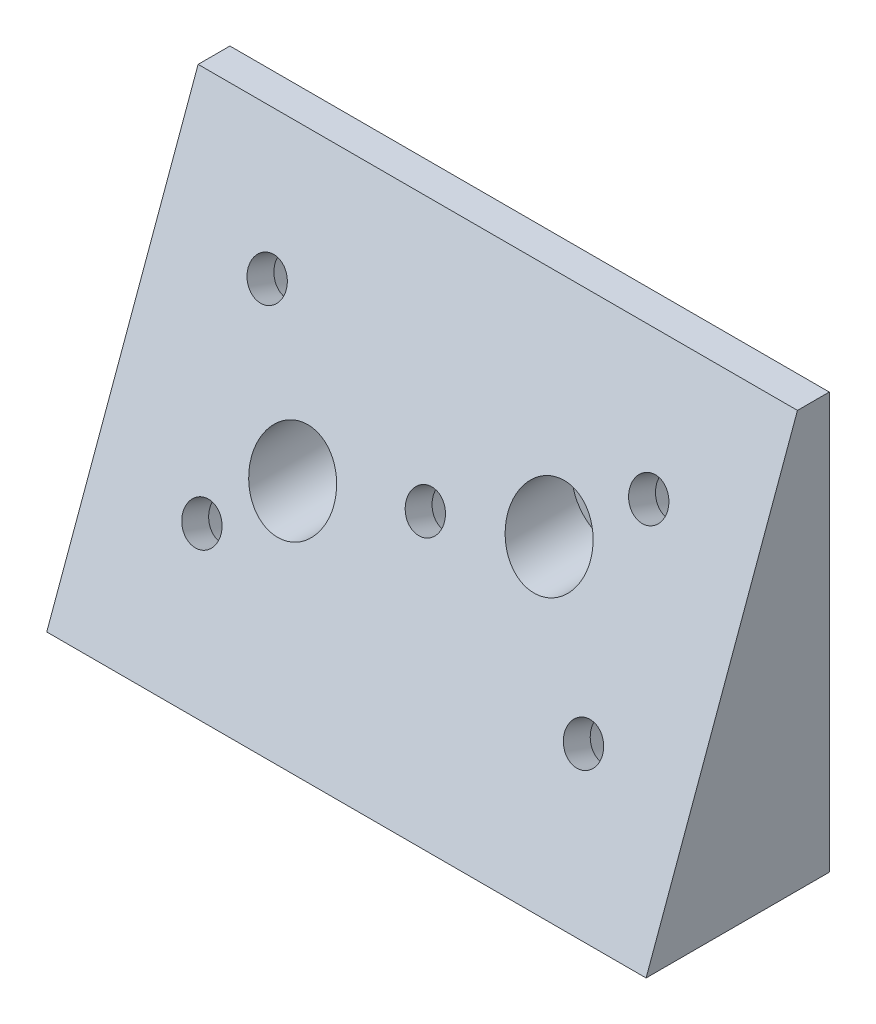
ISO-10303-21;
HEADER;
FILE_DESCRIPTION(('STEP AP214'),'2;1');
FILE_NAME('part.step','',(''),(''),'','','');
FILE_SCHEMA(('AUTOMOTIVE_DESIGN { 1 0 10303 214 1 1 1 1 }'));
ENDSEC;
DATA;
#1=APPLICATION_CONTEXT('core data for automotive mechanical design processes');
#2=APPLICATION_PROTOCOL_DEFINITION('international standard','automotive_design',2000,#1);
#3=PRODUCT_CONTEXT('',#1,'mechanical');
#4=PRODUCT('Part','Part','',(#3));
#5=PRODUCT_RELATED_PRODUCT_CATEGORY('part','',(#4));
#6=PRODUCT_DEFINITION_FORMATION('','',#4);
#7=PRODUCT_DEFINITION_CONTEXT('part definition',#1,'design');
#8=PRODUCT_DEFINITION('design','',#6,#7);
#9=PRODUCT_DEFINITION_SHAPE('','',#8);
#10=(LENGTH_UNIT() NAMED_UNIT(*) SI_UNIT(.MILLI.,.METRE.));
#11=(NAMED_UNIT(*) PLANE_ANGLE_UNIT() SI_UNIT($,.RADIAN.));
#12=(NAMED_UNIT(*) SI_UNIT($,.STERADIAN.) SOLID_ANGLE_UNIT());
#13=UNCERTAINTY_MEASURE_WITH_UNIT(LENGTH_MEASURE(1.E-05),#10,'distance_accuracy_value','');
#14=(GEOMETRIC_REPRESENTATION_CONTEXT(3) GLOBAL_UNCERTAINTY_ASSIGNED_CONTEXT((#13)) GLOBAL_UNIT_ASSIGNED_CONTEXT((#10,
#11,#12)) REPRESENTATION_CONTEXT('',''));
#15=CARTESIAN_POINT('',(0.,0.,0.));
#16=DIRECTION('',(0.,0.,1.));
#17=DIRECTION('',(1.,0.,0.));
#18=AXIS2_PLACEMENT_3D('',#15,#16,#17);
#19=CARTESIAN_POINT('',(0.,0.,5.));
#20=DIRECTION('',(1.,0.,0.));
#21=DIRECTION('',(0.,1.,0.));
#22=AXIS2_PLACEMENT_3D('',#19,#20,#21);
#23=PLANE('',#22);
#24=DIRECTION('',(0.,-1.,0.));
#25=VECTOR('',#24,1.);
#26=CARTESIAN_POINT('',(0.,0.,0.));
#27=LINE('',#26,#25);
#28=CARTESIAN_POINT('',(0.,0.,0.));
#29=VERTEX_POINT('',#28);
#30=CARTESIAN_POINT('',(0.,-65.39427142,0.));
#31=VERTEX_POINT('',#30);
#32=EDGE_CURVE('E90',#29,#31,#27,.T.);
#33=ORIENTED_EDGE('',*,*,#32,.T.);
#34=DIRECTION('',(0.,0.,-1.));
#35=VECTOR('',#34,1.);
#36=CARTESIAN_POINT('',(0.,-65.39427142,5.));
#37=LINE('',#36,#35);
#38=CARTESIAN_POINT('',(0.,-65.39427142,28.80156829));
#39=VERTEX_POINT('',#38);
#40=EDGE_CURVE('E11',#39,#31,#37,.T.);
#41=ORIENTED_EDGE('',*,*,#40,.F.);
#42=DIRECTION('',(0.,-0.939692620778542,0.342020143345907));
#43=VECTOR('',#42,1.);
#44=CARTESIAN_POINT('',(0.,-65.39427142,28.80156829));
#45=LINE('',#44,#43);
#46=CARTESIAN_POINT('',(0.,0.,5.));
#47=VERTEX_POINT('',#46);
#48=EDGE_CURVE('E172',#47,#39,#45,.T.);
#49=ORIENTED_EDGE('',*,*,#48,.F.);
#50=DIRECTION('',(0.,0.,-1.));
#51=VECTOR('',#50,1.);
#52=CARTESIAN_POINT('',(0.,0.,5.));
#53=LINE('',#52,#51);
#54=EDGE_CURVE('E85',#47,#29,#53,.T.);
#55=ORIENTED_EDGE('',*,*,#54,.T.);
#56=EDGE_LOOP('',(#33,#41,#49,#55));
#57=FACE_BOUND('',#56,.T.);
#58=ADVANCED_FACE('F37',(#57),#23,.F.);
#59=CARTESIAN_POINT('',(0.,-65.39427142,5.));
#60=DIRECTION('',(0.,1.,0.));
#61=DIRECTION('',(0.,0.,1.));
#62=AXIS2_PLACEMENT_3D('',#59,#60,#61);
#63=PLANE('',#62);
#64=DIRECTION('',(1.,0.,0.));
#65=VECTOR('',#64,1.);
#66=CARTESIAN_POINT('',(0.,-65.39427142,0.));
#67=LINE('',#66,#65);
#68=CARTESIAN_POINT('',(94.24092637,-65.39427142,0.));
#69=VERTEX_POINT('',#68);
#70=EDGE_CURVE('E76',#31,#69,#67,.T.);
#71=ORIENTED_EDGE('',*,*,#70,.T.);
#72=DIRECTION('',(0.,0.,-1.));
#73=VECTOR('',#72,1.);
#74=CARTESIAN_POINT('',(94.24092637,-65.39427142,5.));
#75=LINE('',#74,#73);
#76=CARTESIAN_POINT('',(94.24092637,-65.39427142,28.80156829));
#77=VERTEX_POINT('',#76);
#78=EDGE_CURVE('E46',#77,#69,#75,.T.);
#79=ORIENTED_EDGE('',*,*,#78,.F.);
#80=DIRECTION('',(1.,0.,0.));
#81=VECTOR('',#80,1.);
#82=CARTESIAN_POINT('',(0.,-65.39427142,28.80156829));
#83=LINE('',#82,#81);
#84=EDGE_CURVE('E175',#39,#77,#83,.T.);
#85=ORIENTED_EDGE('',*,*,#84,.F.);
#86=ORIENTED_EDGE('',*,*,#40,.T.);
#87=EDGE_LOOP('',(#71,#79,#85,#86));
#88=FACE_BOUND('',#87,.T.);
#89=ADVANCED_FACE('F180',(#88),#63,.F.);
#90=CARTESIAN_POINT('',(94.24092637,-65.39427142,5.));
#91=DIRECTION('',(-1.,0.,0.));
#92=DIRECTION('',(0.,0.,1.));
#93=AXIS2_PLACEMENT_3D('',#90,#91,#92);
#94=PLANE('',#93);
#95=DIRECTION('',(0.,1.,0.));
#96=VECTOR('',#95,1.);
#97=CARTESIAN_POINT('',(94.24092637,-65.39427142,0.));
#98=LINE('',#97,#96);
#99=CARTESIAN_POINT('',(94.24092637,0.,0.));
#100=VERTEX_POINT('',#99);
#101=EDGE_CURVE('E70',#69,#100,#98,.T.);
#102=ORIENTED_EDGE('',*,*,#101,.T.);
#103=DIRECTION('',(0.,0.,-1.));
#104=VECTOR('',#103,1.);
#105=CARTESIAN_POINT('',(94.24092637,0.,5.));
#106=LINE('',#105,#104);
#107=CARTESIAN_POINT('',(94.24092637,0.,5.));
#108=VERTEX_POINT('',#107);
#109=EDGE_CURVE('E54',#108,#100,#106,.T.);
#110=ORIENTED_EDGE('',*,*,#109,.F.);
#111=DIRECTION('',(0.,-0.939692620778542,0.342020143345907));
#112=VECTOR('',#111,1.);
#113=CARTESIAN_POINT('',(94.24092637,-65.39427142,28.80156829));
#114=LINE('',#113,#112);
#115=EDGE_CURVE('E169',#108,#77,#114,.T.);
#116=ORIENTED_EDGE('',*,*,#115,.T.);
#117=ORIENTED_EDGE('',*,*,#78,.T.);
#118=EDGE_LOOP('',(#102,#110,#116,#117));
#119=FACE_BOUND('',#118,.T.);
#120=ADVANCED_FACE('F71',(#119),#94,.F.);
#121=CARTESIAN_POINT('',(0.,0.,5.));
#122=DIRECTION('',(0.,-1.,0.));
#123=DIRECTION('',(0.,0.,-1.));
#124=AXIS2_PLACEMENT_3D('',#121,#122,#123);
#125=PLANE('',#124);
#126=DIRECTION('',(-1.,0.,0.));
#127=VECTOR('',#126,1.);
#128=CARTESIAN_POINT('',(0.,0.,0.));
#129=LINE('',#128,#127);
#130=EDGE_CURVE('E75',#100,#29,#129,.T.);
#131=ORIENTED_EDGE('',*,*,#130,.T.);
#132=ORIENTED_EDGE('',*,*,#54,.F.);
#133=DIRECTION('',(-1.,0.,0.));
#134=VECTOR('',#133,1.);
#135=CARTESIAN_POINT('',(0.,0.,5.));
#136=LINE('',#135,#134);
#137=EDGE_CURVE('E83',#108,#47,#136,.T.);
#138=ORIENTED_EDGE('',*,*,#137,.F.);
#139=ORIENTED_EDGE('',*,*,#109,.T.);
#140=EDGE_LOOP('',(#131,#132,#138,#139));
#141=FACE_BOUND('',#140,.T.);
#142=ADVANCED_FACE('F79',(#141),#125,.F.);
#143=CARTESIAN_POINT('',(0.,0.,0.));
#144=DIRECTION('',(0.,0.,1.));
#145=DIRECTION('',(1.,0.,0.));
#146=AXIS2_PLACEMENT_3D('',#143,#144,#145);
#147=PLANE('',#146);
#148=CARTESIAN_POINT('',(17.20092637,-21.5572592662761,0.));
#149=DIRECTION('',(0.,0.,1.));
#150=DIRECTION('',(0.,1.,0.));
#151=AXIS2_PLACEMENT_3D('',#148,#149,#150);
#152=ELLIPSE('',#151,5.05484441930021,4.75);
#153=CARTESIAN_POINT('',(17.20092637,-16.5024148469759,0.));
#154=VERTEX_POINT('',#153);
#155=EDGE_CURVE('E40',#154,#154,#152,.T.);
#156=ORIENTED_EDGE('',*,*,#155,.T.);
#157=EDGE_LOOP('',(#156));
#158=FACE_BOUND('',#157,.T.);
#159=CARTESIAN_POINT('',(77.20092637,-21.5572592662761,0.));
#160=DIRECTION('',(0.,0.,1.));
#161=DIRECTION('',(0.,1.,0.));
#162=AXIS2_PLACEMENT_3D('',#159,#160,#161);
#163=ELLIPSE('',#162,5.05484441930021,4.75);
#164=CARTESIAN_POINT('',(77.20092637,-16.5024148469759,0.));
#165=VERTEX_POINT('',#164);
#166=EDGE_CURVE('E135',#165,#165,#163,.T.);
#167=ORIENTED_EDGE('',*,*,#166,.T.);
#168=EDGE_LOOP('',(#167));
#169=FACE_BOUND('',#168,.T.);
#170=CARTESIAN_POINT('',(77.20092637,-53.4825924408038,0.));
#171=DIRECTION('',(0.,0.,1.));
#172=DIRECTION('',(0.,1.,0.));
#173=AXIS2_PLACEMENT_3D('',#170,#171,#172);
#174=ELLIPSE('',#173,5.05484441930021,4.75000000000001);
#175=CARTESIAN_POINT('',(77.20092637,-48.4277480215036,0.));
#176=VERTEX_POINT('',#175);
#177=EDGE_CURVE('E133',#176,#176,#174,.T.);
#178=ORIENTED_EDGE('',*,*,#177,.T.);
#179=EDGE_LOOP('',(#178));
#180=FACE_BOUND('',#179,.T.);
#181=CARTESIAN_POINT('',(47.20092637,-37.51992585354,0.));
#182=DIRECTION('',(0.,0.,1.));
#183=DIRECTION('',(0.,1.,0.));
#184=AXIS2_PLACEMENT_3D('',#181,#182,#183);
#185=ELLIPSE('',#184,5.0548444193002,4.75);
#186=CARTESIAN_POINT('',(47.20092637,-32.4650814342398,0.));
#187=VERTEX_POINT('',#186);
#188=EDGE_CURVE('E130',#187,#187,#185,.T.);
#189=ORIENTED_EDGE('',*,*,#188,.T.);
#190=EDGE_LOOP('',(#189));
#191=FACE_BOUND('',#190,.T.);
#192=CARTESIAN_POINT('',(17.20092637,-53.4825924408038,0.));
#193=DIRECTION('',(0.,0.,1.));
#194=DIRECTION('',(0.,1.,0.));
#195=AXIS2_PLACEMENT_3D('',#192,#193,#194);
#196=ELLIPSE('',#195,5.05484441930021,4.75);
#197=CARTESIAN_POINT('',(17.20092637,-48.4277480215036,0.));
#198=VERTEX_POINT('',#197);
#199=EDGE_CURVE('E127',#198,#198,#196,.T.);
#200=ORIENTED_EDGE('',*,*,#199,.T.);
#201=EDGE_LOOP('',(#200));
#202=FACE_BOUND('',#201,.T.);
#203=CARTESIAN_POINT('',(64.9901151539067,-26.9262359790259,0.));
#204=DIRECTION('',(0.,0.,-1.));
#205=DIRECTION('',(-1.,0.,0.));
#206=AXIS2_PLACEMENT_3D('',#203,#204,#205);
#207=CIRCLE('',#206,4.5);
#208=CARTESIAN_POINT('',(60.4901151539067,-26.9262359790259,0.));
#209=VERTEX_POINT('',#208);
#210=EDGE_CURVE('E166',#209,#209,#207,.T.);
#211=ORIENTED_EDGE('',*,*,#210,.F.);
#212=EDGE_LOOP('',(#211));
#213=FACE_BOUND('',#212,.T.);
#214=CARTESIAN_POINT('',(28.0218479846269,-36.143460200093,0.));
#215=DIRECTION('',(0.,0.,-1.));
#216=DIRECTION('',(-1.,0.,0.));
#217=AXIS2_PLACEMENT_3D('',#214,#215,#216);
#218=CIRCLE('',#217,4.5);
#219=CARTESIAN_POINT('',(23.5218479846269,-36.143460200093,0.));
#220=VERTEX_POINT('',#219);
#221=EDGE_CURVE('E110',#220,#220,#218,.T.);
#222=ORIENTED_EDGE('',*,*,#221,.F.);
#223=EDGE_LOOP('',(#222));
#224=FACE_BOUND('',#223,.T.);
#225=ORIENTED_EDGE('',*,*,#32,.F.);
#226=ORIENTED_EDGE('',*,*,#130,.F.);
#227=ORIENTED_EDGE('',*,*,#101,.F.);
#228=ORIENTED_EDGE('',*,*,#70,.F.);
#229=EDGE_LOOP('',(#225,#226,#227,#228));
#230=FACE_BOUND('',#229,.T.);
#231=ADVANCED_FACE('F88',(#158,#169,#180,#191,#202,#213,#224,#230),#147,.F.);
#232=CARTESIAN_POINT('',(0.,-65.39427142,28.80156829));
#233=DIRECTION('',(0.,0.342020143345907,0.939692620778542));
#234=DIRECTION('',(0.,-0.939692620778542,0.342020143345907));
#235=AXIS2_PLACEMENT_3D('',#232,#233,#234);
#236=PLANE('',#235);
#237=CARTESIAN_POINT('',(47.20092637,-31.5239592551219,16.4737828358538));
#238=DIRECTION('',(0.,0.342020143345907,0.939692620778542));
#239=DIRECTION('',(0.,-0.939692620778542,0.342020143345907));
#240=AXIS2_PLACEMENT_3D('',#237,#238,#239);
#241=CIRCLE('',#240,3.);
#242=CARTESIAN_POINT('',(47.20092637,-34.3430371174575,17.4998432658915));
#243=VERTEX_POINT('',#242);
#244=EDGE_CURVE('E153',#243,#243,#241,.T.);
#245=ORIENTED_EDGE('',*,*,#244,.F.);
#246=EDGE_LOOP('',(#245));
#247=FACE_BOUND('',#246,.T.);
#248=CARTESIAN_POINT('',(17.20092637,-45.6193485668,21.6040849860424));
#249=DIRECTION('',(0.,0.342020143345907,0.939692620778542));
#250=DIRECTION('',(0.,-0.939692620778542,0.342020143345907));
#251=AXIS2_PLACEMENT_3D('',#248,#249,#250);
#252=CIRCLE('',#251,3.);
#253=CARTESIAN_POINT('',(17.20092637,-48.4384264291357,22.6301454160801));
#254=VERTEX_POINT('',#253);
#255=EDGE_CURVE('E149',#254,#254,#252,.T.);
#256=ORIENTED_EDGE('',*,*,#255,.F.);
#257=EDGE_LOOP('',(#256));
#258=FACE_BOUND('',#257,.T.);
#259=CARTESIAN_POINT('',(17.20092637,-17.4285699434438,11.3434806856652));
#260=DIRECTION('',(0.,0.342020143345907,0.939692620778542));
#261=DIRECTION('',(0.,-0.939692620778542,0.342020143345907));
#262=AXIS2_PLACEMENT_3D('',#259,#260,#261);
#263=CIRCLE('',#262,3.);
#264=CARTESIAN_POINT('',(17.20092637,-20.2476478057794,12.3695411157029));
#265=VERTEX_POINT('',#264);
#266=EDGE_CURVE('E144',#265,#265,#263,.T.);
#267=ORIENTED_EDGE('',*,*,#266,.F.);
#268=EDGE_LOOP('',(#267));
#269=FACE_BOUND('',#268,.T.);
#270=CARTESIAN_POINT('',(77.20092637,-17.4285699434438,11.3434806856652));
#271=DIRECTION('',(0.,0.342020143345907,0.939692620778542));
#272=DIRECTION('',(0.,-0.939692620778542,0.342020143345907));
#273=AXIS2_PLACEMENT_3D('',#270,#271,#272);
#274=CIRCLE('',#273,3.00000000000001);
#275=CARTESIAN_POINT('',(77.20092637,-20.2476478057794,12.3695411157029));
#276=VERTEX_POINT('',#275);
#277=EDGE_CURVE('E140',#276,#276,#274,.T.);
#278=ORIENTED_EDGE('',*,*,#277,.F.);
#279=EDGE_LOOP('',(#278));
#280=FACE_BOUND('',#279,.T.);
#281=CARTESIAN_POINT('',(77.20092637,-45.6193485668,21.6040849860424));
#282=DIRECTION('',(0.,0.342020143345907,0.939692620778542));
#283=DIRECTION('',(0.,-0.939692620778542,0.342020143345907));
#284=AXIS2_PLACEMENT_3D('',#281,#282,#283);
#285=CIRCLE('',#284,3.00000000000001);
#286=CARTESIAN_POINT('',(77.20092637,-48.4384264291357,22.6301454160801));
#287=VERTEX_POINT('',#286);
#288=EDGE_CURVE('E156',#287,#287,#285,.T.);
#289=ORIENTED_EDGE('',*,*,#288,.F.);
#290=EDGE_LOOP('',(#289));
#291=FACE_BOUND('',#290,.T.);
#292=CARTESIAN_POINT('',(64.9901151539067,-26.9262359790259,14.8003484178498));
#293=DIRECTION('',(0.,0.342020143345907,0.939692620778542));
#294=DIRECTION('',(0.,0.939692620778542,-0.342020143345907));
#295=AXIS2_PLACEMENT_3D('',#292,#293,#294);
#296=ELLIPSE('',#295,6.91715552114765,6.5);
#297=CARTESIAN_POINT('',(64.9901151539067,-20.4262359790259,12.434541894961));
#298=VERTEX_POINT('',#297);
#299=EDGE_CURVE('E107',#298,#298,#296,.T.);
#300=ORIENTED_EDGE('',*,*,#299,.F.);
#301=EDGE_LOOP('',(#300));
#302=FACE_BOUND('',#301,.T.);
#303=CARTESIAN_POINT('',(28.0218479846269,-36.143460200093,18.1551436771006));
#304=DIRECTION('',(0.,0.342020143345907,0.939692620778542));
#305=DIRECTION('',(0.,0.939692620778542,-0.342020143345907));
#306=AXIS2_PLACEMENT_3D('',#303,#304,#305);
#307=ELLIPSE('',#306,6.91715552114765,6.5);
#308=CARTESIAN_POINT('',(28.0218479846269,-29.643460200093,15.7893371542117));
#309=VERTEX_POINT('',#308);
#310=EDGE_CURVE('E104',#309,#309,#307,.T.);
#311=ORIENTED_EDGE('',*,*,#310,.F.);
#312=EDGE_LOOP('',(#311));
#313=FACE_BOUND('',#312,.T.);
#314=ORIENTED_EDGE('',*,*,#115,.F.);
#315=ORIENTED_EDGE('',*,*,#137,.T.);
#316=ORIENTED_EDGE('',*,*,#48,.T.);
#317=ORIENTED_EDGE('',*,*,#84,.T.);
#318=EDGE_LOOP('',(#314,#315,#316,#317));
#319=FACE_BOUND('',#318,.T.);
#320=ADVANCED_FACE('F188',(#247,#258,#269,#280,#291,#302,#313,#319),#236,.T.);
#321=CARTESIAN_POINT('',(28.0218479846269,-36.143460200093,94.24092637));
#322=DIRECTION('',(0.,0.,-1.));
#323=DIRECTION('',(-1.,0.,0.));
#324=AXIS2_PLACEMENT_3D('',#321,#322,#323);
#325=CYLINDRICAL_SURFACE('',#324,4.5);
#326=CARTESIAN_POINT('',(28.0218479846269,-36.143460200093,4.69));
#327=DIRECTION('',(0.,0.,-1.));
#328=DIRECTION('',(-1.,0.,0.));
#329=AXIS2_PLACEMENT_3D('',#326,#327,#328);
#330=CIRCLE('',#329,4.5);
#331=CARTESIAN_POINT('',(23.5218479846269,-36.143460200093,4.69));
#332=VERTEX_POINT('',#331);
#333=EDGE_CURVE('E100',#332,#332,#330,.F.);
#334=ORIENTED_EDGE('',*,*,#333,.T.);
#335=EDGE_LOOP('',(#334));
#336=FACE_BOUND('',#335,.T.);
#337=ORIENTED_EDGE('',*,*,#221,.T.);
#338=EDGE_LOOP('',(#337));
#339=FACE_BOUND('',#338,.T.);
#340=ADVANCED_FACE('F190',(#336,#339),#325,.F.);
#341=CARTESIAN_POINT('',(64.9901151539067,-26.9262359790259,94.24092637));
#342=DIRECTION('',(0.,0.,-1.));
#343=DIRECTION('',(-1.,0.,0.));
#344=AXIS2_PLACEMENT_3D('',#341,#342,#343);
#345=CYLINDRICAL_SURFACE('',#344,4.5);
#346=CARTESIAN_POINT('',(64.9901151539067,-26.9262359790259,4.69));
#347=DIRECTION('',(0.,0.,-1.));
#348=DIRECTION('',(-1.,0.,0.));
#349=AXIS2_PLACEMENT_3D('',#346,#347,#348);
#350=CIRCLE('',#349,4.5);
#351=CARTESIAN_POINT('',(60.4901151539067,-26.9262359790259,4.69));
#352=VERTEX_POINT('',#351);
#353=EDGE_CURVE('E97',#352,#352,#350,.F.);
#354=ORIENTED_EDGE('',*,*,#353,.T.);
#355=EDGE_LOOP('',(#354));
#356=FACE_BOUND('',#355,.T.);
#357=ORIENTED_EDGE('',*,*,#210,.T.);
#358=EDGE_LOOP('',(#357));
#359=FACE_BOUND('',#358,.T.);
#360=ADVANCED_FACE('F197',(#356,#359),#345,.F.);
#361=CARTESIAN_POINT('',(64.9901151539067,-26.9262359790259,4.69));
#362=DIRECTION('',(0.,0.,-1.));
#363=DIRECTION('',(-1.,0.,0.));
#364=AXIS2_PLACEMENT_3D('',#361,#362,#363);
#365=PLANE('',#364);
#366=CARTESIAN_POINT('',(64.9901151539067,-26.9262359790259,4.69));
#367=DIRECTION('',(0.,0.,-1.));
#368=DIRECTION('',(-1.,0.,0.));
#369=AXIS2_PLACEMENT_3D('',#366,#367,#368);
#370=CIRCLE('',#369,6.5);
#371=CARTESIAN_POINT('',(58.4901151539067,-26.9262359790259,4.69));
#372=VERTEX_POINT('',#371);
#373=EDGE_CURVE('E101',#372,#372,#370,.T.);
#374=ORIENTED_EDGE('',*,*,#373,.F.);
#375=EDGE_LOOP('',(#374));
#376=FACE_BOUND('',#375,.T.);
#377=ORIENTED_EDGE('',*,*,#353,.F.);
#378=EDGE_LOOP('',(#377));
#379=FACE_BOUND('',#378,.T.);
#380=ADVANCED_FACE('F386',(#376,#379),#365,.F.);
#381=CARTESIAN_POINT('',(64.9901151539067,-26.9262359790259,98.93092637));
#382=DIRECTION('',(0.,0.,-1.));
#383=DIRECTION('',(-1.,0.,0.));
#384=AXIS2_PLACEMENT_3D('',#381,#382,#383);
#385=CYLINDRICAL_SURFACE('',#384,6.5);
#386=ORIENTED_EDGE('',*,*,#299,.T.);
#387=EDGE_LOOP('',(#386));
#388=FACE_BOUND('',#387,.T.);
#389=ORIENTED_EDGE('',*,*,#373,.T.);
#390=EDGE_LOOP('',(#389));
#391=FACE_BOUND('',#390,.T.);
#392=ADVANCED_FACE('F389',(#388,#391),#385,.F.);
#393=CARTESIAN_POINT('',(28.0218479846269,-36.143460200093,4.69));
#394=DIRECTION('',(0.,0.,-1.));
#395=DIRECTION('',(-1.,0.,0.));
#396=AXIS2_PLACEMENT_3D('',#393,#394,#395);
#397=PLANE('',#396);
#398=CARTESIAN_POINT('',(28.0218479846269,-36.143460200093,4.69));
#399=DIRECTION('',(0.,0.,-1.));
#400=DIRECTION('',(-1.,0.,0.));
#401=AXIS2_PLACEMENT_3D('',#398,#399,#400);
#402=CIRCLE('',#401,6.5);
#403=CARTESIAN_POINT('',(21.5218479846269,-36.143460200093,4.69));
#404=VERTEX_POINT('',#403);
#405=EDGE_CURVE('E161',#404,#404,#402,.T.);
#406=ORIENTED_EDGE('',*,*,#405,.F.);
#407=EDGE_LOOP('',(#406));
#408=FACE_BOUND('',#407,.T.);
#409=ORIENTED_EDGE('',*,*,#333,.F.);
#410=EDGE_LOOP('',(#409));
#411=FACE_BOUND('',#410,.T.);
#412=ADVANCED_FACE('F393',(#408,#411),#397,.F.);
#413=CARTESIAN_POINT('',(28.0218479846269,-36.143460200093,98.93092637));
#414=DIRECTION('',(0.,0.,-1.));
#415=DIRECTION('',(-1.,0.,0.));
#416=AXIS2_PLACEMENT_3D('',#413,#414,#415);
#417=CYLINDRICAL_SURFACE('',#416,6.5);
#418=ORIENTED_EDGE('',*,*,#310,.T.);
#419=EDGE_LOOP('',(#418));
#420=FACE_BOUND('',#419,.T.);
#421=ORIENTED_EDGE('',*,*,#405,.T.);
#422=EDGE_LOOP('',(#421));
#423=FACE_BOUND('',#422,.T.);
#424=ADVANCED_FACE('F237',(#420,#423),#417,.F.);
#425=CARTESIAN_POINT('',(77.20092637,-77.8516437129185,-66.9534180991805));
#426=DIRECTION('',(0.,0.342020143345907,0.939692620778542));
#427=DIRECTION('',(0.,-0.939692620778542,0.342020143345907));
#428=AXIS2_PLACEMENT_3D('',#425,#426,#427);
#429=CYLINDRICAL_SURFACE('',#428,3.00000000000001);
#430=CARTESIAN_POINT('',(77.20092637,-47.1584392118566,17.375468192539));
#431=DIRECTION('',(0.,0.342020143345907,0.939692620778542));
#432=DIRECTION('',(0.,-0.939692620778542,0.342020143345907));
#433=AXIS2_PLACEMENT_3D('',#430,#431,#432);
#434=CIRCLE('',#433,3.00000000000001);
#435=CARTESIAN_POINT('',(77.20092637,-49.9775170741923,18.4015286225767));
#436=VERTEX_POINT('',#435);
#437=EDGE_CURVE('E124',#436,#436,#434,.F.);
#438=ORIENTED_EDGE('',*,*,#437,.T.);
#439=EDGE_LOOP('',(#438));
#440=FACE_BOUND('',#439,.T.);
#441=ORIENTED_EDGE('',*,*,#288,.T.);
#442=EDGE_LOOP('',(#441));
#443=FACE_BOUND('',#442,.T.);
#444=ADVANCED_FACE('F231',(#440,#443),#429,.F.);
#445=CARTESIAN_POINT('',(77.20092637,-49.6608650895622,-77.2140223995577));
#446=DIRECTION('',(0.,0.342020143345907,0.939692620778542));
#447=DIRECTION('',(0.,-0.939692620778542,0.342020143345907));
#448=AXIS2_PLACEMENT_3D('',#445,#446,#447);
#449=CYLINDRICAL_SURFACE('',#448,3.00000000000001);
#450=CARTESIAN_POINT('',(77.20092637,-18.9676605885003,7.11486389216177));
#451=DIRECTION('',(0.,0.342020143345907,0.939692620778542));
#452=DIRECTION('',(0.,-0.939692620778542,0.342020143345907));
#453=AXIS2_PLACEMENT_3D('',#450,#451,#452);
#454=CIRCLE('',#453,3.00000000000001);
#455=CARTESIAN_POINT('',(77.20092637,-21.786738450836,8.1409243221995));
#456=VERTEX_POINT('',#455);
#457=EDGE_CURVE('E121',#456,#456,#454,.F.);
#458=ORIENTED_EDGE('',*,*,#457,.T.);
#459=EDGE_LOOP('',(#458));
#460=FACE_BOUND('',#459,.T.);
#461=ORIENTED_EDGE('',*,*,#277,.T.);
#462=EDGE_LOOP('',(#461));
#463=FACE_BOUND('',#462,.T.);
#464=ADVANCED_FACE('F236',(#460,#463),#449,.F.);
#465=CARTESIAN_POINT('',(17.20092637,-49.6608650895622,-77.2140223995577));
#466=DIRECTION('',(0.,0.342020143345907,0.939692620778542));
#467=DIRECTION('',(0.,-0.939692620778542,0.342020143345907));
#468=AXIS2_PLACEMENT_3D('',#465,#466,#467);
#469=CYLINDRICAL_SURFACE('',#468,3.);
#470=CARTESIAN_POINT('',(17.20092637,-18.9676605885003,7.11486389216177));
#471=DIRECTION('',(0.,0.342020143345907,0.939692620778542));
#472=DIRECTION('',(0.,-0.939692620778542,0.342020143345907));
#473=AXIS2_PLACEMENT_3D('',#470,#471,#472);
#474=CIRCLE('',#473,3.);
#475=CARTESIAN_POINT('',(17.20092637,-21.786738450836,8.1409243221995));
#476=VERTEX_POINT('',#475);
#477=EDGE_CURVE('E118',#476,#476,#474,.F.);
#478=ORIENTED_EDGE('',*,*,#477,.T.);
#479=EDGE_LOOP('',(#478));
#480=FACE_BOUND('',#479,.T.);
#481=ORIENTED_EDGE('',*,*,#266,.T.);
#482=EDGE_LOOP('',(#481));
#483=FACE_BOUND('',#482,.T.);
#484=ADVANCED_FACE('F249',(#480,#483),#469,.F.);
#485=CARTESIAN_POINT('',(17.20092637,-77.8516437129185,-66.9534180991805));
#486=DIRECTION('',(0.,0.342020143345907,0.939692620778542));
#487=DIRECTION('',(0.,-0.939692620778542,0.342020143345907));
#488=AXIS2_PLACEMENT_3D('',#485,#486,#487);
#489=CYLINDRICAL_SURFACE('',#488,3.);
#490=CARTESIAN_POINT('',(17.20092637,-47.1584392118566,17.375468192539));
#491=DIRECTION('',(0.,0.342020143345907,0.939692620778542));
#492=DIRECTION('',(0.,-0.939692620778542,0.342020143345907));
#493=AXIS2_PLACEMENT_3D('',#490,#491,#492);
#494=CIRCLE('',#493,3.);
#495=CARTESIAN_POINT('',(17.20092637,-49.9775170741922,18.4015286225767));
#496=VERTEX_POINT('',#495);
#497=EDGE_CURVE('E114',#496,#496,#494,.F.);
#498=ORIENTED_EDGE('',*,*,#497,.T.);
#499=EDGE_LOOP('',(#498));
#500=FACE_BOUND('',#499,.T.);
#501=ORIENTED_EDGE('',*,*,#255,.T.);
#502=EDGE_LOOP('',(#501));
#503=FACE_BOUND('',#502,.T.);
#504=ADVANCED_FACE('F259',(#500,#503),#489,.F.);
#505=CARTESIAN_POINT('',(47.20092637,-63.7562544012404,-72.0837202493691));
#506=DIRECTION('',(0.,0.342020143345907,0.939692620778542));
#507=DIRECTION('',(0.,-0.939692620778542,0.342020143345907));
#508=AXIS2_PLACEMENT_3D('',#505,#506,#507);
#509=CYLINDRICAL_SURFACE('',#508,3.);
#510=CARTESIAN_POINT('',(47.20092637,-33.0630499001785,12.2451660423504));
#511=DIRECTION('',(0.,0.342020143345907,0.939692620778542));
#512=DIRECTION('',(0.,-0.939692620778542,0.342020143345907));
#513=AXIS2_PLACEMENT_3D('',#510,#511,#512);
#514=CIRCLE('',#513,3.);
#515=CARTESIAN_POINT('',(47.20092637,-35.8821277625141,13.2712264723881));
#516=VERTEX_POINT('',#515);
#517=EDGE_CURVE('E111',#516,#516,#514,.F.);
#518=ORIENTED_EDGE('',*,*,#517,.T.);
#519=EDGE_LOOP('',(#518));
#520=FACE_BOUND('',#519,.T.);
#521=ORIENTED_EDGE('',*,*,#244,.T.);
#522=EDGE_LOOP('',(#521));
#523=FACE_BOUND('',#522,.T.);
#524=ADVANCED_FACE('F269',(#520,#523),#509,.F.);
#525=CARTESIAN_POINT('',(47.20092637,-65.2953450462969,-76.3123370428725));
#526=DIRECTION('',(0.,0.342020143345907,0.939692620778542));
#527=DIRECTION('',(0.,-0.939692620778542,0.342020143345907));
#528=AXIS2_PLACEMENT_3D('',#525,#526,#527);
#529=CYLINDRICAL_SURFACE('',#528,4.75);
#530=CARTESIAN_POINT('',(47.20092637,-33.0630499001785,12.2451660423504));
#531=DIRECTION('',(0.,0.342020143345907,0.939692620778542));
#532=DIRECTION('',(0.,-0.939692620778542,0.342020143345907));
#533=AXIS2_PLACEMENT_3D('',#530,#531,#532);
#534=CIRCLE('',#533,4.75);
#535=CARTESIAN_POINT('',(47.20092637,-37.5265898488766,13.8697617232434));
#536=VERTEX_POINT('',#535);
#537=EDGE_CURVE('E484',#536,#536,#534,.T.);
#538=ORIENTED_EDGE('',*,*,#537,.T.);
#539=EDGE_LOOP('',(#538));
#540=FACE_BOUND('',#539,.T.);
#541=ORIENTED_EDGE('',*,*,#188,.F.);
#542=EDGE_LOOP('',(#541));
#543=FACE_BOUND('',#542,.T.);
#544=ADVANCED_FACE('F279',(#540,#543),#529,.F.);
#545=CARTESIAN_POINT('',(47.20092637,-33.0630499001785,12.2451660423504));
#546=DIRECTION('',(0.,0.342020143345907,0.939692620778542));
#547=DIRECTION('',(0.,-0.939692620778542,0.342020143345907));
#548=AXIS2_PLACEMENT_3D('',#545,#546,#547);
#549=PLANE('',#548);
#550=ORIENTED_EDGE('',*,*,#537,.F.);
#551=EDGE_LOOP('',(#550));
#552=FACE_BOUND('',#551,.T.);
#553=ORIENTED_EDGE('',*,*,#517,.F.);
#554=EDGE_LOOP('',(#553));
#555=FACE_BOUND('',#554,.T.);
#556=ADVANCED_FACE('F289',(#552,#555),#549,.F.);
#557=CARTESIAN_POINT('',(17.20092637,-79.3907343579751,-71.1820348926839));
#558=DIRECTION('',(0.,0.342020143345907,0.939692620778542));
#559=DIRECTION('',(0.,-0.939692620778542,0.342020143345907));
#560=AXIS2_PLACEMENT_3D('',#557,#558,#559);
#561=CYLINDRICAL_SURFACE('',#560,4.75);
#562=CARTESIAN_POINT('',(17.20092637,-47.1584392118566,17.375468192539));
#563=DIRECTION('',(0.,0.342020143345907,0.939692620778542));
#564=DIRECTION('',(0.,-0.939692620778542,0.342020143345907));
#565=AXIS2_PLACEMENT_3D('',#562,#563,#564);
#566=CIRCLE('',#565,4.75);
#567=CARTESIAN_POINT('',(17.20092637,-51.6219791605547,19.000063873432));
#568=VERTEX_POINT('',#567);
#569=EDGE_CURVE('E115',#568,#568,#566,.T.);
#570=ORIENTED_EDGE('',*,*,#569,.T.);
#571=EDGE_LOOP('',(#570));
#572=FACE_BOUND('',#571,.T.);
#573=ORIENTED_EDGE('',*,*,#199,.F.);
#574=EDGE_LOOP('',(#573));
#575=FACE_BOUND('',#574,.T.);
#576=ADVANCED_FACE('F299',(#572,#575),#561,.F.);
#577=CARTESIAN_POINT('',(17.20092637,-47.1584392118566,17.375468192539));
#578=DIRECTION('',(0.,0.342020143345907,0.939692620778542));
#579=DIRECTION('',(0.,-0.939692620778542,0.342020143345907));
#580=AXIS2_PLACEMENT_3D('',#577,#578,#579);
#581=PLANE('',#580);
#582=ORIENTED_EDGE('',*,*,#569,.F.);
#583=EDGE_LOOP('',(#582));
#584=FACE_BOUND('',#583,.T.);
#585=ORIENTED_EDGE('',*,*,#497,.F.);
#586=EDGE_LOOP('',(#585));
#587=FACE_BOUND('',#586,.T.);
#588=ADVANCED_FACE('F309',(#584,#587),#581,.F.);
#589=CARTESIAN_POINT('',(17.20092637,-51.1999557346188,-81.4426391930612));
#590=DIRECTION('',(0.,0.342020143345907,0.939692620778542));
#591=DIRECTION('',(0.,-0.939692620778542,0.342020143345907));
#592=AXIS2_PLACEMENT_3D('',#589,#590,#591);
#593=CYLINDRICAL_SURFACE('',#592,4.75);
#594=CARTESIAN_POINT('',(17.20092637,-18.9676605885003,7.11486389216177));
#595=DIRECTION('',(0.,0.342020143345907,0.939692620778542));
#596=DIRECTION('',(0.,-0.939692620778542,0.342020143345907));
#597=AXIS2_PLACEMENT_3D('',#594,#595,#596);
#598=CIRCLE('',#597,4.75);
#599=CARTESIAN_POINT('',(17.20092637,-23.4312005371984,8.73945957305483));
#600=VERTEX_POINT('',#599);
#601=EDGE_CURVE('E487',#600,#600,#598,.T.);
#602=ORIENTED_EDGE('',*,*,#601,.T.);
#603=EDGE_LOOP('',(#602));
#604=FACE_BOUND('',#603,.T.);
#605=ORIENTED_EDGE('',*,*,#155,.F.);
#606=EDGE_LOOP('',(#605));
#607=FACE_BOUND('',#606,.T.);
#608=ADVANCED_FACE('F319',(#604,#607),#593,.F.);
#609=CARTESIAN_POINT('',(17.20092637,-18.9676605885003,7.11486389216177));
#610=DIRECTION('',(0.,0.342020143345907,0.939692620778542));
#611=DIRECTION('',(0.,-0.939692620778542,0.342020143345907));
#612=AXIS2_PLACEMENT_3D('',#609,#610,#611);
#613=PLANE('',#612);
#614=ORIENTED_EDGE('',*,*,#601,.F.);
#615=EDGE_LOOP('',(#614));
#616=FACE_BOUND('',#615,.T.);
#617=ORIENTED_EDGE('',*,*,#477,.F.);
#618=EDGE_LOOP('',(#617));
#619=FACE_BOUND('',#618,.T.);
#620=ADVANCED_FACE('F329',(#616,#619),#613,.F.);
#621=CARTESIAN_POINT('',(77.20092637,-51.1999557346188,-81.4426391930612));
#622=DIRECTION('',(0.,0.342020143345907,0.939692620778542));
#623=DIRECTION('',(0.,-0.939692620778542,0.342020143345907));
#624=AXIS2_PLACEMENT_3D('',#621,#622,#623);
#625=CYLINDRICAL_SURFACE('',#624,4.75);
#626=CARTESIAN_POINT('',(77.20092637,-18.9676605885003,7.11486389216177));
#627=DIRECTION('',(0.,0.342020143345907,0.939692620778542));
#628=DIRECTION('',(0.,-0.939692620778542,0.342020143345907));
#629=AXIS2_PLACEMENT_3D('',#626,#627,#628);
#630=CIRCLE('',#629,4.75);
#631=CARTESIAN_POINT('',(77.20092637,-23.4312005371984,8.73945957305483));
#632=VERTEX_POINT('',#631);
#633=EDGE_CURVE('E483',#632,#632,#630,.T.);
#634=ORIENTED_EDGE('',*,*,#633,.T.);
#635=EDGE_LOOP('',(#634));
#636=FACE_BOUND('',#635,.T.);
#637=ORIENTED_EDGE('',*,*,#166,.F.);
#638=EDGE_LOOP('',(#637));
#639=FACE_BOUND('',#638,.T.);
#640=ADVANCED_FACE('F339',(#636,#639),#625,.F.);
#641=CARTESIAN_POINT('',(77.20092637,-18.9676605885003,7.11486389216177));
#642=DIRECTION('',(0.,0.342020143345907,0.939692620778542));
#643=DIRECTION('',(0.,-0.939692620778542,0.342020143345907));
#644=AXIS2_PLACEMENT_3D('',#641,#642,#643);
#645=PLANE('',#644);
#646=ORIENTED_EDGE('',*,*,#633,.F.);
#647=EDGE_LOOP('',(#646));
#648=FACE_BOUND('',#647,.T.);
#649=ORIENTED_EDGE('',*,*,#457,.F.);
#650=EDGE_LOOP('',(#649));
#651=FACE_BOUND('',#650,.T.);
#652=ADVANCED_FACE('F349',(#648,#651),#645,.F.);
#653=CARTESIAN_POINT('',(77.20092637,-79.3907343579751,-71.1820348926839));
#654=DIRECTION('',(0.,0.342020143345907,0.939692620778542));
#655=DIRECTION('',(0.,-0.939692620778542,0.342020143345907));
#656=AXIS2_PLACEMENT_3D('',#653,#654,#655);
#657=CYLINDRICAL_SURFACE('',#656,4.75000000000001);
#658=CARTESIAN_POINT('',(77.20092637,-47.1584392118566,17.375468192539));
#659=DIRECTION('',(0.,0.342020143345907,0.939692620778542));
#660=DIRECTION('',(0.,-0.939692620778542,0.342020143345907));
#661=AXIS2_PLACEMENT_3D('',#658,#659,#660);
#662=CIRCLE('',#661,4.75000000000001);
#663=CARTESIAN_POINT('',(77.20092637,-51.6219791605547,19.000063873432));
#664=VERTEX_POINT('',#663);
#665=EDGE_CURVE('E478',#664,#664,#662,.T.);
#666=ORIENTED_EDGE('',*,*,#665,.T.);
#667=EDGE_LOOP('',(#666));
#668=FACE_BOUND('',#667,.T.);
#669=ORIENTED_EDGE('',*,*,#177,.F.);
#670=EDGE_LOOP('',(#669));
#671=FACE_BOUND('',#670,.T.);
#672=ADVANCED_FACE('F359',(#668,#671),#657,.F.);
#673=CARTESIAN_POINT('',(77.20092637,-47.1584392118566,17.375468192539));
#674=DIRECTION('',(0.,0.342020143345907,0.939692620778542));
#675=DIRECTION('',(0.,-0.939692620778542,0.342020143345907));
#676=AXIS2_PLACEMENT_3D('',#673,#674,#675);
#677=PLANE('',#676);
#678=ORIENTED_EDGE('',*,*,#665,.F.);
#679=EDGE_LOOP('',(#678));
#680=FACE_BOUND('',#679,.T.);
#681=ORIENTED_EDGE('',*,*,#437,.F.);
#682=EDGE_LOOP('',(#681));
#683=FACE_BOUND('',#682,.T.);
#684=ADVANCED_FACE('F369',(#680,#683),#677,.F.);
#685=CLOSED_SHELL('',(#58,#89,#120,#142,#231,#320,#340,#360,#380,#392,#412,#424,#444,#464,#484,
#504,#524,#544,#556,#576,#588,#608,#620,#640,#652,#672,#684));
#686=MANIFOLD_SOLID_BREP('B2',#685);
#687=ADVANCED_BREP_SHAPE_REPRESENTATION('',(#18,#686),#14);
#688=SHAPE_DEFINITION_REPRESENTATION(#9,#687);
ENDSEC;
END-ISO-10303-21;
